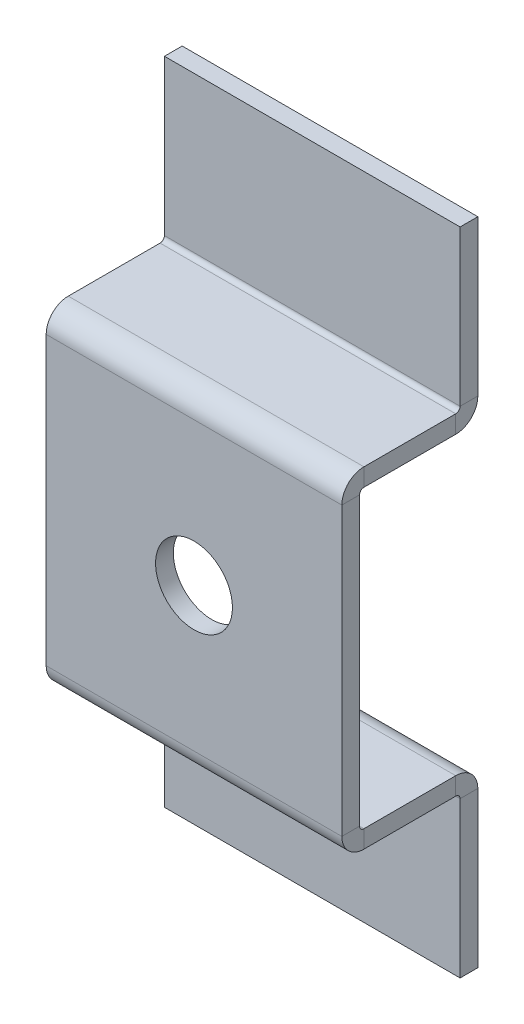
ISO-10303-21;
HEADER;
FILE_DESCRIPTION(('STEP AP214'),'2;1');
FILE_NAME('part.step','',(''),(''),'','','');
FILE_SCHEMA(('AUTOMOTIVE_DESIGN { 1 0 10303 214 1 1 1 1 }'));
ENDSEC;
DATA;
#1=APPLICATION_CONTEXT('core data for automotive mechanical design processes');
#2=APPLICATION_PROTOCOL_DEFINITION('international standard','automotive_design',2000,#1);
#3=PRODUCT_CONTEXT('',#1,'mechanical');
#4=PRODUCT('Part','Part','',(#3));
#5=PRODUCT_RELATED_PRODUCT_CATEGORY('part','',(#4));
#6=PRODUCT_DEFINITION_FORMATION('','',#4);
#7=PRODUCT_DEFINITION_CONTEXT('part definition',#1,'design');
#8=PRODUCT_DEFINITION('design','',#6,#7);
#9=PRODUCT_DEFINITION_SHAPE('','',#8);
#10=(LENGTH_UNIT() NAMED_UNIT(*) SI_UNIT(.MILLI.,.METRE.));
#11=(NAMED_UNIT(*) PLANE_ANGLE_UNIT() SI_UNIT($,.RADIAN.));
#12=(NAMED_UNIT(*) SI_UNIT($,.STERADIAN.) SOLID_ANGLE_UNIT());
#13=UNCERTAINTY_MEASURE_WITH_UNIT(LENGTH_MEASURE(1.E-05),#10,'distance_accuracy_value','');
#14=(GEOMETRIC_REPRESENTATION_CONTEXT(3) GLOBAL_UNCERTAINTY_ASSIGNED_CONTEXT((#13)) GLOBAL_UNIT_ASSIGNED_CONTEXT((#10,
#11,#12)) REPRESENTATION_CONTEXT('',''));
#15=CARTESIAN_POINT('',(0.,0.,0.));
#16=DIRECTION('',(0.,0.,1.));
#17=DIRECTION('',(1.,0.,0.));
#18=AXIS2_PLACEMENT_3D('',#15,#16,#17);
#19=CARTESIAN_POINT('',(0.,53.0000000000001,-20.));
#20=DIRECTION('',(-1.,0.,0.));
#21=DIRECTION('',(0.,0.,1.));
#22=AXIS2_PLACEMENT_3D('',#19,#20,#21);
#23=PLANE('',#22);
#24=DIRECTION('',(0.,0.,-1.));
#25=VECTOR('',#24,1.);
#26=CARTESIAN_POINT('',(0.,53.0000000000001,-20.));
#27=LINE('',#26,#25);
#28=CARTESIAN_POINT('',(0.,53.,-3.73659999999999));
#29=VERTEX_POINT('',#28);
#30=CARTESIAN_POINT('',(0.,53.0000000000001,-19.2634));
#31=VERTEX_POINT('',#30);
#32=EDGE_CURVE('E349',#29,#31,#27,.T.);
#33=ORIENTED_EDGE('',*,*,#32,.T.);
#34=DIRECTION('',(0.,-1.,0.));
#35=VECTOR('',#34,1.);
#36=CARTESIAN_POINT('',(0.,53.0000000000001,-19.2634));
#37=LINE('',#36,#35);
#38=CARTESIAN_POINT('',(0.,50.0000000000001,-19.2634));
#39=VERTEX_POINT('',#38);
#40=EDGE_CURVE('E231',#31,#39,#37,.T.);
#41=ORIENTED_EDGE('',*,*,#40,.T.);
#42=DIRECTION('',(0.,0.,-1.));
#43=VECTOR('',#42,1.);
#44=CARTESIAN_POINT('',(0.,50.0000000000001,-20.));
#45=LINE('',#44,#43);
#46=CARTESIAN_POINT('',(0.,50.,-3.7366));
#47=VERTEX_POINT('',#46);
#48=EDGE_CURVE('E348',#47,#39,#45,.T.);
#49=ORIENTED_EDGE('',*,*,#48,.F.);
#50=DIRECTION('',(0.,1.,0.));
#51=VECTOR('',#50,1.);
#52=CARTESIAN_POINT('',(0.,50.,-3.7366));
#53=LINE('',#52,#51);
#54=EDGE_CURVE('E334',#47,#29,#53,.T.);
#55=ORIENTED_EDGE('',*,*,#54,.T.);
#56=EDGE_LOOP('',(#33,#41,#49,#55));
#57=FACE_BOUND('',#56,.T.);
#58=ADVANCED_FACE('F37',(#57),#23,.T.);
#59=CARTESIAN_POINT('',(0.,53.,1.9415104735525E-13));
#60=DIRECTION('',(0.,1.,0.));
#61=DIRECTION('',(0.,0.,1.));
#62=AXIS2_PLACEMENT_3D('',#59,#60,#61);
#63=PLANE('',#62);
#64=DIRECTION('',(0.,0.,1.));
#65=VECTOR('',#64,1.);
#66=CARTESIAN_POINT('',(50.,53.,-2.99999999999999));
#67=LINE('',#66,#65);
#68=CARTESIAN_POINT('',(50.,53.0000000000001,-19.2634));
#69=VERTEX_POINT('',#68);
#70=CARTESIAN_POINT('',(50.,53.,-3.73659999999999));
#71=VERTEX_POINT('',#70);
#72=EDGE_CURVE('E351',#69,#71,#67,.T.);
#73=ORIENTED_EDGE('',*,*,#72,.F.);
#74=DIRECTION('',(-1.,0.,0.));
#75=VECTOR('',#74,1.);
#76=CARTESIAN_POINT('',(0.,53.0000000000001,-19.2634));
#77=LINE('',#76,#75);
#78=EDGE_CURVE('E61',#31,#69,#77,.F.);
#79=ORIENTED_EDGE('',*,*,#78,.F.);
#80=ORIENTED_EDGE('',*,*,#32,.F.);
#81=DIRECTION('',(1.,0.,0.));
#82=VECTOR('',#81,1.);
#83=CARTESIAN_POINT('',(0.,53.,-3.73659999999999));
#84=LINE('',#83,#82);
#85=EDGE_CURVE('E343',#29,#71,#84,.T.);
#86=ORIENTED_EDGE('',*,*,#85,.T.);
#87=EDGE_LOOP('',(#73,#79,#80,#86));
#88=FACE_BOUND('',#87,.T.);
#89=ADVANCED_FACE('F398',(#88),#63,.T.);
#90=CARTESIAN_POINT('',(0.,50.,1.83676603338721E-13));
#91=DIRECTION('',(0.,1.,0.));
#92=DIRECTION('',(0.,0.,1.));
#93=AXIS2_PLACEMENT_3D('',#90,#91,#92);
#94=PLANE('',#93);
#95=DIRECTION('',(-1.,0.,0.));
#96=VECTOR('',#95,1.);
#97=CARTESIAN_POINT('',(0.,50.0000000000001,-19.2634));
#98=LINE('',#97,#96);
#99=CARTESIAN_POINT('',(50.,50.0000000000001,-19.2634));
#100=VERTEX_POINT('',#99);
#101=EDGE_CURVE('E184',#39,#100,#98,.F.);
#102=ORIENTED_EDGE('',*,*,#101,.T.);
#103=DIRECTION('',(0.,0.,1.));
#104=VECTOR('',#103,1.);
#105=CARTESIAN_POINT('',(50.,50.,-3.));
#106=LINE('',#105,#104);
#107=CARTESIAN_POINT('',(50.,50.,-3.7366));
#108=VERTEX_POINT('',#107);
#109=EDGE_CURVE('E352',#100,#108,#106,.T.);
#110=ORIENTED_EDGE('',*,*,#109,.T.);
#111=DIRECTION('',(1.,0.,0.));
#112=VECTOR('',#111,1.);
#113=CARTESIAN_POINT('',(0.,50.,-3.7366));
#114=LINE('',#113,#112);
#115=EDGE_CURVE('E337',#47,#108,#114,.T.);
#116=ORIENTED_EDGE('',*,*,#115,.F.);
#117=ORIENTED_EDGE('',*,*,#48,.T.);
#118=EDGE_LOOP('',(#102,#110,#116,#117));
#119=FACE_BOUND('',#118,.T.);
#120=ADVANCED_FACE('F406',(#119),#94,.F.);
#121=CARTESIAN_POINT('',(50.,-3.,-2.99999999999999));
#122=DIRECTION('',(1.,0.,0.));
#123=DIRECTION('',(0.,0.,-1.));
#124=AXIS2_PLACEMENT_3D('',#121,#122,#123);
#125=PLANE('',#124);
#126=DIRECTION('',(0.,0.,-1.));
#127=VECTOR('',#126,1.);
#128=CARTESIAN_POINT('',(50.,-3.,-2.99999999999999));
#129=LINE('',#128,#127);
#130=CARTESIAN_POINT('',(50.,-3.,-3.73659999999999));
#131=VERTEX_POINT('',#130);
#132=CARTESIAN_POINT('',(50.,-3.00000000000006,-19.2634));
#133=VERTEX_POINT('',#132);
#134=EDGE_CURVE('E304',#131,#133,#129,.T.);
#135=ORIENTED_EDGE('',*,*,#134,.T.);
#136=DIRECTION('',(0.,1.,0.));
#137=VECTOR('',#136,1.);
#138=CARTESIAN_POINT('',(50.,-3.00000000000006,-19.2634));
#139=LINE('',#138,#137);
#140=CARTESIAN_POINT('',(50.,0.,-19.2634));
#141=VERTEX_POINT('',#140);
#142=EDGE_CURVE('E277',#133,#141,#139,.T.);
#143=ORIENTED_EDGE('',*,*,#142,.T.);
#144=DIRECTION('',(0.,0.,-1.));
#145=VECTOR('',#144,1.);
#146=CARTESIAN_POINT('',(50.,0.,-3.));
#147=LINE('',#146,#145);
#148=CARTESIAN_POINT('',(50.,0.,-3.7366));
#149=VERTEX_POINT('',#148);
#150=EDGE_CURVE('E303',#149,#141,#147,.T.);
#151=ORIENTED_EDGE('',*,*,#150,.F.);
#152=DIRECTION('',(0.,-1.,0.));
#153=VECTOR('',#152,1.);
#154=CARTESIAN_POINT('',(50.,0.,-3.7366));
#155=LINE('',#154,#153);
#156=EDGE_CURVE('E290',#149,#131,#155,.T.);
#157=ORIENTED_EDGE('',*,*,#156,.T.);
#158=EDGE_LOOP('',(#135,#143,#151,#157));
#159=FACE_BOUND('',#158,.T.);
#160=ADVANCED_FACE('F430',(#159),#125,.T.);
#161=CARTESIAN_POINT('',(0.,-2.99999999999999,0.));
#162=DIRECTION('',(0.,1.,0.));
#163=DIRECTION('',(0.,0.,1.));
#164=AXIS2_PLACEMENT_3D('',#161,#162,#163);
#165=PLANE('',#164);
#166=DIRECTION('',(1.,0.,0.));
#167=VECTOR('',#166,1.);
#168=CARTESIAN_POINT('',(50.,-3.00000000000006,-19.2634));
#169=LINE('',#168,#167);
#170=CARTESIAN_POINT('',(0.,-3.00000000000006,-19.2634));
#171=VERTEX_POINT('',#170);
#172=EDGE_CURVE('E283',#133,#171,#169,.F.);
#173=ORIENTED_EDGE('',*,*,#172,.F.);
#174=ORIENTED_EDGE('',*,*,#134,.F.);
#175=DIRECTION('',(1.,0.,0.));
#176=VECTOR('',#175,1.);
#177=CARTESIAN_POINT('',(0.,-3.,-3.73659999999999));
#178=LINE('',#177,#176);
#179=CARTESIAN_POINT('',(0.,-3.,-3.73659999999999));
#180=VERTEX_POINT('',#179);
#181=EDGE_CURVE('E299',#180,#131,#178,.T.);
#182=ORIENTED_EDGE('',*,*,#181,.F.);
#183=DIRECTION('',(0.,0.,1.));
#184=VECTOR('',#183,1.);
#185=CARTESIAN_POINT('',(0.,-3.00000000000006,-20.));
#186=LINE('',#185,#184);
#187=EDGE_CURVE('E307',#171,#180,#186,.T.);
#188=ORIENTED_EDGE('',*,*,#187,.F.);
#189=EDGE_LOOP('',(#173,#174,#182,#188));
#190=FACE_BOUND('',#189,.T.);
#191=ADVANCED_FACE('F443',(#190),#165,.F.);
#192=CARTESIAN_POINT('',(0.,0.,0.));
#193=DIRECTION('',(0.,1.,0.));
#194=DIRECTION('',(0.,0.,1.));
#195=AXIS2_PLACEMENT_3D('',#192,#193,#194);
#196=PLANE('',#195);
#197=ORIENTED_EDGE('',*,*,#150,.T.);
#198=DIRECTION('',(1.,0.,0.));
#199=VECTOR('',#198,1.);
#200=CARTESIAN_POINT('',(50.,0.,-19.2634));
#201=LINE('',#200,#199);
#202=CARTESIAN_POINT('',(0.,0.,-19.2634));
#203=VERTEX_POINT('',#202);
#204=EDGE_CURVE('E270',#141,#203,#201,.F.);
#205=ORIENTED_EDGE('',*,*,#204,.T.);
#206=DIRECTION('',(0.,0.,1.));
#207=VECTOR('',#206,1.);
#208=CARTESIAN_POINT('',(0.,0.,-20.));
#209=LINE('',#208,#207);
#210=CARTESIAN_POINT('',(0.,0.,-3.7366));
#211=VERTEX_POINT('',#210);
#212=EDGE_CURVE('E308',#203,#211,#209,.T.);
#213=ORIENTED_EDGE('',*,*,#212,.T.);
#214=DIRECTION('',(-1.,0.,0.));
#215=VECTOR('',#214,1.);
#216=CARTESIAN_POINT('',(50.,0.,-3.7366));
#217=LINE('',#216,#215);
#218=EDGE_CURVE('E293',#149,#211,#217,.T.);
#219=ORIENTED_EDGE('',*,*,#218,.F.);
#220=EDGE_LOOP('',(#197,#205,#213,#219));
#221=FACE_BOUND('',#220,.T.);
#222=ADVANCED_FACE('F427',(#221),#196,.T.);
#223=CARTESIAN_POINT('',(0.,0.,-3.));
#224=DIRECTION('',(0.,0.,-1.));
#225=DIRECTION('',(-1.,0.,0.));
#226=AXIS2_PLACEMENT_3D('',#223,#224,#225);
#227=PLANE('',#226);
#228=CARTESIAN_POINT('',(25.,25.0000000000001,-3.));
#229=DIRECTION('',(0.,0.,-1.));
#230=DIRECTION('',(-1.,0.,0.));
#231=AXIS2_PLACEMENT_3D('',#228,#229,#230);
#232=CIRCLE('',#231,6.50000000000001);
#233=CARTESIAN_POINT('',(18.5,25.0000000000001,-3.));
#234=VERTEX_POINT('',#233);
#235=EDGE_CURVE('E487',#234,#234,#232,.T.);
#236=ORIENTED_EDGE('',*,*,#235,.F.);
#237=EDGE_LOOP('',(#236));
#238=FACE_BOUND('',#237,.T.);
#239=DIRECTION('',(0.,1.,0.));
#240=VECTOR('',#239,1.);
#241=CARTESIAN_POINT('',(50.,0.,-3.));
#242=LINE('',#241,#240);
#243=CARTESIAN_POINT('',(50.,0.736600000000001,-3.));
#244=VERTEX_POINT('',#243);
#245=CARTESIAN_POINT('',(50.,49.2634,-3.));
#246=VERTEX_POINT('',#245);
#247=EDGE_CURVE('E11',#244,#246,#242,.T.);
#248=ORIENTED_EDGE('',*,*,#247,.F.);
#249=DIRECTION('',(-1.,0.,0.));
#250=VECTOR('',#249,1.);
#251=CARTESIAN_POINT('',(0.,0.736599999999997,-3.));
#252=LINE('',#251,#250);
#253=CARTESIAN_POINT('',(0.,0.736599999999997,-3.));
#254=VERTEX_POINT('',#253);
#255=EDGE_CURVE('E326',#254,#244,#252,.F.);
#256=ORIENTED_EDGE('',*,*,#255,.F.);
#257=DIRECTION('',(0.,-1.,0.));
#258=VECTOR('',#257,1.);
#259=CARTESIAN_POINT('',(0.,0.,-3.));
#260=LINE('',#259,#258);
#261=CARTESIAN_POINT('',(0.,49.2634,-3.));
#262=VERTEX_POINT('',#261);
#263=EDGE_CURVE('E46',#262,#254,#260,.T.);
#264=ORIENTED_EDGE('',*,*,#263,.F.);
#265=DIRECTION('',(1.,0.,0.));
#266=VECTOR('',#265,1.);
#267=CARTESIAN_POINT('',(50.,49.2634,-3.00000000000001));
#268=LINE('',#267,#266);
#269=EDGE_CURVE('E370',#246,#262,#268,.F.);
#270=ORIENTED_EDGE('',*,*,#269,.F.);
#271=EDGE_LOOP('',(#248,#256,#264,#270));
#272=FACE_BOUND('',#271,.T.);
#273=ADVANCED_FACE('F413',(#238,#272),#227,.T.);
#274=CARTESIAN_POINT('',(0.,0.,0.));
#275=DIRECTION('',(0.,0.,-1.));
#276=DIRECTION('',(-1.,0.,0.));
#277=AXIS2_PLACEMENT_3D('',#274,#275,#276);
#278=PLANE('',#277);
#279=CARTESIAN_POINT('',(25.,25.0000000000001,0.));
#280=DIRECTION('',(0.,0.,1.));
#281=DIRECTION('',(1.,0.,0.));
#282=AXIS2_PLACEMENT_3D('',#279,#280,#281);
#283=CIRCLE('',#282,6.50000000000001);
#284=CARTESIAN_POINT('',(31.5,25.0000000000001,0.));
#285=VERTEX_POINT('',#284);
#286=EDGE_CURVE('E485',#285,#285,#283,.T.);
#287=ORIENTED_EDGE('',*,*,#286,.F.);
#288=EDGE_LOOP('',(#287));
#289=FACE_BOUND('',#288,.T.);
#290=DIRECTION('',(-1.,0.,0.));
#291=VECTOR('',#290,1.);
#292=CARTESIAN_POINT('',(0.,0.736600000000005,0.));
#293=LINE('',#292,#291);
#294=CARTESIAN_POINT('',(0.,0.736600000000005,0.));
#295=VERTEX_POINT('',#294);
#296=CARTESIAN_POINT('',(50.,0.736600000000001,0.));
#297=VERTEX_POINT('',#296);
#298=EDGE_CURVE('E314',#295,#297,#293,.F.);
#299=ORIENTED_EDGE('',*,*,#298,.T.);
#300=DIRECTION('',(0.,1.,0.));
#301=VECTOR('',#300,1.);
#302=CARTESIAN_POINT('',(50.,0.,0.));
#303=LINE('',#302,#301);
#304=CARTESIAN_POINT('',(50.,49.2634,0.));
#305=VERTEX_POINT('',#304);
#306=EDGE_CURVE('E41',#297,#305,#303,.T.);
#307=ORIENTED_EDGE('',*,*,#306,.T.);
#308=DIRECTION('',(1.,0.,0.));
#309=VECTOR('',#308,1.);
#310=CARTESIAN_POINT('',(50.,49.2634,0.));
#311=LINE('',#310,#309);
#312=CARTESIAN_POINT('',(0.,49.2634,0.));
#313=VERTEX_POINT('',#312);
#314=EDGE_CURVE('E358',#305,#313,#311,.F.);
#315=ORIENTED_EDGE('',*,*,#314,.T.);
#316=DIRECTION('',(0.,-1.,0.));
#317=VECTOR('',#316,1.);
#318=CARTESIAN_POINT('',(0.,0.,0.));
#319=LINE('',#318,#317);
#320=EDGE_CURVE('E378',#313,#295,#319,.T.);
#321=ORIENTED_EDGE('',*,*,#320,.T.);
#322=EDGE_LOOP('',(#299,#307,#315,#321));
#323=FACE_BOUND('',#322,.T.);
#324=ADVANCED_FACE('F386',(#289,#323),#278,.F.);
#325=CARTESIAN_POINT('',(0.,0.,-3.));
#326=DIRECTION('',(-1.,0.,0.));
#327=DIRECTION('',(0.,0.,1.));
#328=AXIS2_PLACEMENT_3D('',#325,#326,#327);
#329=PLANE('',#328);
#330=ORIENTED_EDGE('',*,*,#263,.T.);
#331=DIRECTION('',(0.,0.,1.));
#332=VECTOR('',#331,1.);
#333=CARTESIAN_POINT('',(0.,0.736599999999997,-3.));
#334=LINE('',#333,#332);
#335=EDGE_CURVE('E320',#254,#295,#334,.T.);
#336=ORIENTED_EDGE('',*,*,#335,.T.);
#337=ORIENTED_EDGE('',*,*,#320,.F.);
#338=DIRECTION('',(0.,0.,1.));
#339=VECTOR('',#338,1.);
#340=CARTESIAN_POINT('',(0.,49.2634,-3.00000000000001));
#341=LINE('',#340,#339);
#342=EDGE_CURVE('E375',#262,#313,#341,.T.);
#343=ORIENTED_EDGE('',*,*,#342,.F.);
#344=EDGE_LOOP('',(#330,#336,#337,#343));
#345=FACE_BOUND('',#344,.T.);
#346=ADVANCED_FACE('F39',(#345),#329,.T.);
#347=CARTESIAN_POINT('',(50.,0.,-3.));
#348=DIRECTION('',(1.,0.,0.));
#349=DIRECTION('',(0.,0.,-1.));
#350=AXIS2_PLACEMENT_3D('',#347,#348,#349);
#351=PLANE('',#350);
#352=DIRECTION('',(0.,0.,1.));
#353=VECTOR('',#352,1.);
#354=CARTESIAN_POINT('',(50.,0.736600000000001,-3.));
#355=LINE('',#354,#353);
#356=EDGE_CURVE('E331',#244,#297,#355,.T.);
#357=ORIENTED_EDGE('',*,*,#356,.F.);
#358=ORIENTED_EDGE('',*,*,#247,.T.);
#359=DIRECTION('',(0.,0.,1.));
#360=VECTOR('',#359,1.);
#361=CARTESIAN_POINT('',(50.,49.2634,-3.00000000000001));
#362=LINE('',#361,#360);
#363=EDGE_CURVE('E364',#246,#305,#362,.T.);
#364=ORIENTED_EDGE('',*,*,#363,.T.);
#365=ORIENTED_EDGE('',*,*,#306,.F.);
#366=EDGE_LOOP('',(#357,#358,#364,#365));
#367=FACE_BOUND('',#366,.T.);
#368=ADVANCED_FACE('F453',(#367),#351,.T.);
#369=CARTESIAN_POINT('',(0.,49.2634,-3.7366));
#370=DIRECTION('',(-1.,0.,0.));
#371=DIRECTION('',(0.,0.,1.));
#372=AXIS2_PLACEMENT_3D('',#369,#370,#371);
#373=PLANE('',#372);
#374=ORIENTED_EDGE('',*,*,#54,.F.);
#375=CARTESIAN_POINT('',(0.,49.2634,-3.7366));
#376=DIRECTION('',(1.,0.,0.));
#377=DIRECTION('',(0.,0.,-1.));
#378=AXIS2_PLACEMENT_3D('',#375,#376,#377);
#379=CIRCLE('',#378,0.73659999999999);
#380=EDGE_CURVE('E367',#262,#47,#379,.F.);
#381=ORIENTED_EDGE('',*,*,#380,.F.);
#382=ORIENTED_EDGE('',*,*,#342,.T.);
#383=CARTESIAN_POINT('',(0.,49.2634,-3.7366));
#384=DIRECTION('',(1.,0.,0.));
#385=DIRECTION('',(0.,0.,-1.));
#386=AXIS2_PLACEMENT_3D('',#383,#384,#385);
#387=CIRCLE('',#386,3.73659999999999);
#388=EDGE_CURVE('E360',#313,#29,#387,.F.);
#389=ORIENTED_EDGE('',*,*,#388,.T.);
#390=EDGE_LOOP('',(#374,#381,#382,#389));
#391=FACE_BOUND('',#390,.T.);
#392=ADVANCED_FACE('F400',(#391),#373,.T.);
#393=CARTESIAN_POINT('',(50.,49.2634,-3.7366));
#394=DIRECTION('',(-1.,0.,0.));
#395=DIRECTION('',(0.,0.,1.));
#396=AXIS2_PLACEMENT_3D('',#393,#394,#395);
#397=PLANE('',#396);
#398=CARTESIAN_POINT('',(50.,49.2634,-3.7366));
#399=DIRECTION('',(1.,0.,0.));
#400=DIRECTION('',(0.,0.,-1.));
#401=AXIS2_PLACEMENT_3D('',#398,#399,#400);
#402=CIRCLE('',#401,0.73659999999999);
#403=EDGE_CURVE('E354',#108,#246,#402,.T.);
#404=ORIENTED_EDGE('',*,*,#403,.F.);
#405=DIRECTION('',(0.,1.,0.));
#406=VECTOR('',#405,1.);
#407=CARTESIAN_POINT('',(50.,50.,-3.7366));
#408=LINE('',#407,#406);
#409=EDGE_CURVE('E340',#108,#71,#408,.T.);
#410=ORIENTED_EDGE('',*,*,#409,.T.);
#411=CARTESIAN_POINT('',(50.,49.2634,-3.7366));
#412=DIRECTION('',(1.,0.,0.));
#413=DIRECTION('',(0.,0.,-1.));
#414=AXIS2_PLACEMENT_3D('',#411,#412,#413);
#415=CIRCLE('',#414,3.73659999999999);
#416=EDGE_CURVE('E361',#71,#305,#415,.T.);
#417=ORIENTED_EDGE('',*,*,#416,.T.);
#418=ORIENTED_EDGE('',*,*,#363,.F.);
#419=EDGE_LOOP('',(#404,#410,#417,#418));
#420=FACE_BOUND('',#419,.T.);
#421=ADVANCED_FACE('F396',(#420),#397,.F.);
#422=CARTESIAN_POINT('',(50.,49.2634,-3.7366));
#423=DIRECTION('',(1.,0.,0.));
#424=DIRECTION('',(0.,1.,0.));
#425=AXIS2_PLACEMENT_3D('',#422,#423,#424);
#426=CYLINDRICAL_SURFACE('',#425,3.73659999999999);
#427=ORIENTED_EDGE('',*,*,#314,.F.);
#428=ORIENTED_EDGE('',*,*,#416,.F.);
#429=ORIENTED_EDGE('',*,*,#85,.F.);
#430=ORIENTED_EDGE('',*,*,#388,.F.);
#431=EDGE_LOOP('',(#427,#428,#429,#430));
#432=FACE_BOUND('',#431,.T.);
#433=ADVANCED_FACE('F392',(#432),#426,.T.);
#434=CARTESIAN_POINT('',(50.,49.2634,-3.7366));
#435=DIRECTION('',(1.,0.,0.));
#436=DIRECTION('',(0.,1.,0.));
#437=AXIS2_PLACEMENT_3D('',#434,#435,#436);
#438=CYLINDRICAL_SURFACE('',#437,0.73659999999999);
#439=ORIENTED_EDGE('',*,*,#269,.T.);
#440=ORIENTED_EDGE('',*,*,#380,.T.);
#441=ORIENTED_EDGE('',*,*,#115,.T.);
#442=ORIENTED_EDGE('',*,*,#403,.T.);
#443=EDGE_LOOP('',(#439,#440,#441,#442));
#444=FACE_BOUND('',#443,.T.);
#445=ADVANCED_FACE('F408',(#444),#438,.F.);
#446=CARTESIAN_POINT('',(50.,53.,-2.99999999999999));
#447=DIRECTION('',(1.,0.,0.));
#448=DIRECTION('',(0.,0.,-1.));
#449=AXIS2_PLACEMENT_3D('',#446,#447,#448);
#450=PLANE('',#449);
#451=DIRECTION('',(0.,-1.,0.));
#452=VECTOR('',#451,1.);
#453=CARTESIAN_POINT('',(50.,53.0000000000001,-19.2634));
#454=LINE('',#453,#452);
#455=EDGE_CURVE('E54',#69,#100,#454,.T.);
#456=ORIENTED_EDGE('',*,*,#455,.F.);
#457=ORIENTED_EDGE('',*,*,#72,.T.);
#458=ORIENTED_EDGE('',*,*,#409,.F.);
#459=ORIENTED_EDGE('',*,*,#109,.F.);
#460=EDGE_LOOP('',(#456,#457,#458,#459));
#461=FACE_BOUND('',#460,.T.);
#462=ADVANCED_FACE('F469',(#461),#450,.T.);
#463=CARTESIAN_POINT('',(50.,0.736599999999999,-3.7366));
#464=DIRECTION('',(1.,0.,0.));
#465=DIRECTION('',(0.,1.,0.));
#466=AXIS2_PLACEMENT_3D('',#463,#464,#465);
#467=PLANE('',#466);
#468=ORIENTED_EDGE('',*,*,#156,.F.);
#469=CARTESIAN_POINT('',(50.,0.736599999999999,-3.7366));
#470=DIRECTION('',(-1.,0.,0.));
#471=DIRECTION('',(0.,-1.,0.));
#472=AXIS2_PLACEMENT_3D('',#469,#470,#471);
#473=CIRCLE('',#472,0.736600000000002);
#474=EDGE_CURVE('E323',#244,#149,#473,.F.);
#475=ORIENTED_EDGE('',*,*,#474,.F.);
#476=ORIENTED_EDGE('',*,*,#356,.T.);
#477=CARTESIAN_POINT('',(50.,0.736599999999999,-3.7366));
#478=DIRECTION('',(-1.,0.,0.));
#479=DIRECTION('',(0.,-1.,0.));
#480=AXIS2_PLACEMENT_3D('',#477,#478,#479);
#481=CIRCLE('',#480,3.7366);
#482=EDGE_CURVE('E316',#297,#131,#481,.F.);
#483=ORIENTED_EDGE('',*,*,#482,.T.);
#484=EDGE_LOOP('',(#468,#475,#476,#483));
#485=FACE_BOUND('',#484,.T.);
#486=ADVANCED_FACE('F452',(#485),#467,.T.);
#487=CARTESIAN_POINT('',(0.,0.736599999999996,-3.7366));
#488=DIRECTION('',(1.,0.,0.));
#489=DIRECTION('',(0.,1.,0.));
#490=AXIS2_PLACEMENT_3D('',#487,#488,#489);
#491=PLANE('',#490);
#492=CARTESIAN_POINT('',(0.,0.736599999999996,-3.7366));
#493=DIRECTION('',(-1.,0.,0.));
#494=DIRECTION('',(0.,-1.,0.));
#495=AXIS2_PLACEMENT_3D('',#492,#493,#494);
#496=CIRCLE('',#495,0.736600000000002);
#497=EDGE_CURVE('E310',#211,#254,#496,.T.);
#498=ORIENTED_EDGE('',*,*,#497,.F.);
#499=DIRECTION('',(0.,-1.,0.));
#500=VECTOR('',#499,1.);
#501=CARTESIAN_POINT('',(0.,0.,-3.7366));
#502=LINE('',#501,#500);
#503=EDGE_CURVE('E296',#211,#180,#502,.T.);
#504=ORIENTED_EDGE('',*,*,#503,.T.);
#505=CARTESIAN_POINT('',(0.,0.736599999999996,-3.7366));
#506=DIRECTION('',(-1.,0.,0.));
#507=DIRECTION('',(0.,-1.,0.));
#508=AXIS2_PLACEMENT_3D('',#505,#506,#507);
#509=CIRCLE('',#508,3.7366);
#510=EDGE_CURVE('E317',#180,#295,#509,.T.);
#511=ORIENTED_EDGE('',*,*,#510,.T.);
#512=ORIENTED_EDGE('',*,*,#335,.F.);
#513=EDGE_LOOP('',(#498,#504,#511,#512));
#514=FACE_BOUND('',#513,.T.);
#515=ADVANCED_FACE('F418',(#514),#491,.F.);
#516=CARTESIAN_POINT('',(0.,0.736599999999996,-3.7366));
#517=DIRECTION('',(-1.,0.,0.));
#518=DIRECTION('',(0.,-1.,0.));
#519=AXIS2_PLACEMENT_3D('',#516,#517,#518);
#520=CYLINDRICAL_SURFACE('',#519,3.7366);
#521=ORIENTED_EDGE('',*,*,#298,.F.);
#522=ORIENTED_EDGE('',*,*,#510,.F.);
#523=ORIENTED_EDGE('',*,*,#181,.T.);
#524=ORIENTED_EDGE('',*,*,#482,.F.);
#525=EDGE_LOOP('',(#521,#522,#523,#524));
#526=FACE_BOUND('',#525,.T.);
#527=ADVANCED_FACE('F449',(#526),#520,.T.);
#528=CARTESIAN_POINT('',(0.,0.736599999999996,-3.7366));
#529=DIRECTION('',(-1.,0.,0.));
#530=DIRECTION('',(0.,-1.,0.));
#531=AXIS2_PLACEMENT_3D('',#528,#529,#530);
#532=CYLINDRICAL_SURFACE('',#531,0.736600000000002);
#533=ORIENTED_EDGE('',*,*,#255,.T.);
#534=ORIENTED_EDGE('',*,*,#474,.T.);
#535=ORIENTED_EDGE('',*,*,#218,.T.);
#536=ORIENTED_EDGE('',*,*,#497,.T.);
#537=EDGE_LOOP('',(#533,#534,#535,#536));
#538=FACE_BOUND('',#537,.T.);
#539=ADVANCED_FACE('F422',(#538),#532,.F.);
#540=CARTESIAN_POINT('',(0.,-3.00000000000006,-20.));
#541=DIRECTION('',(-1.,0.,0.));
#542=DIRECTION('',(0.,0.,1.));
#543=AXIS2_PLACEMENT_3D('',#540,#541,#542);
#544=PLANE('',#543);
#545=DIRECTION('',(0.,1.,0.));
#546=VECTOR('',#545,1.);
#547=CARTESIAN_POINT('',(0.,-3.00000000000006,-19.2634));
#548=LINE('',#547,#546);
#549=EDGE_CURVE('E287',#171,#203,#548,.T.);
#550=ORIENTED_EDGE('',*,*,#549,.F.);
#551=ORIENTED_EDGE('',*,*,#187,.T.);
#552=ORIENTED_EDGE('',*,*,#503,.F.);
#553=ORIENTED_EDGE('',*,*,#212,.F.);
#554=EDGE_LOOP('',(#550,#551,#552,#553));
#555=FACE_BOUND('',#554,.T.);
#556=ADVANCED_FACE('F447',(#555),#544,.T.);
#557=CARTESIAN_POINT('',(0.,-3.73660000000006,-19.2634));
#558=DIRECTION('',(-1.,0.,0.));
#559=DIRECTION('',(0.,0.,1.));
#560=AXIS2_PLACEMENT_3D('',#557,#558,#559);
#561=PLANE('',#560);
#562=DIRECTION('',(0.,0.,-1.));
#563=VECTOR('',#562,1.);
#564=CARTESIAN_POINT('',(0.,-3.73660000000006,-20.));
#565=LINE('',#564,#563);
#566=CARTESIAN_POINT('',(0.,-3.73660000000006,-20.));
#567=VERTEX_POINT('',#566);
#568=CARTESIAN_POINT('',(0.,-3.73660000000006,-23.));
#569=VERTEX_POINT('',#568);
#570=EDGE_CURVE('E238',#567,#569,#565,.T.);
#571=ORIENTED_EDGE('',*,*,#570,.F.);
#572=CARTESIAN_POINT('',(0.,-3.73660000000006,-19.2634));
#573=DIRECTION('',(1.,0.,0.));
#574=DIRECTION('',(0.,0.,-1.));
#575=AXIS2_PLACEMENT_3D('',#572,#573,#574);
#576=CIRCLE('',#575,0.7366);
#577=EDGE_CURVE('E280',#171,#567,#576,.F.);
#578=ORIENTED_EDGE('',*,*,#577,.F.);
#579=ORIENTED_EDGE('',*,*,#549,.T.);
#580=CARTESIAN_POINT('',(0.,-3.73660000000006,-19.2634));
#581=DIRECTION('',(1.,0.,0.));
#582=DIRECTION('',(0.,0.,-1.));
#583=AXIS2_PLACEMENT_3D('',#580,#581,#582);
#584=CIRCLE('',#583,3.7366);
#585=EDGE_CURVE('E273',#203,#569,#584,.F.);
#586=ORIENTED_EDGE('',*,*,#585,.T.);
#587=EDGE_LOOP('',(#571,#578,#579,#586));
#588=FACE_BOUND('',#587,.T.);
#589=ADVANCED_FACE('F557',(#588),#561,.T.);
#590=CARTESIAN_POINT('',(50.,-3.73660000000006,-19.2634));
#591=DIRECTION('',(-1.,0.,0.));
#592=DIRECTION('',(0.,0.,1.));
#593=AXIS2_PLACEMENT_3D('',#590,#591,#592);
#594=PLANE('',#593);
#595=CARTESIAN_POINT('',(50.,-3.73660000000006,-19.2634));
#596=DIRECTION('',(1.,0.,0.));
#597=DIRECTION('',(0.,0.,-1.));
#598=AXIS2_PLACEMENT_3D('',#595,#596,#597);
#599=CIRCLE('',#598,0.7366);
#600=CARTESIAN_POINT('',(50.,-3.73660000000006,-20.));
#601=VERTEX_POINT('',#600);
#602=EDGE_CURVE('E269',#601,#133,#599,.T.);
#603=ORIENTED_EDGE('',*,*,#602,.F.);
#604=DIRECTION('',(0.,0.,-1.));
#605=VECTOR('',#604,1.);
#606=CARTESIAN_POINT('',(50.,-3.73660000000006,-20.));
#607=LINE('',#606,#605);
#608=CARTESIAN_POINT('',(50.,-3.73660000000003,-23.));
#609=VERTEX_POINT('',#608);
#610=EDGE_CURVE('E242',#601,#609,#607,.T.);
#611=ORIENTED_EDGE('',*,*,#610,.T.);
#612=CARTESIAN_POINT('',(50.,-3.73660000000006,-19.2634));
#613=DIRECTION('',(1.,0.,0.));
#614=DIRECTION('',(0.,0.,-1.));
#615=AXIS2_PLACEMENT_3D('',#612,#613,#614);
#616=CIRCLE('',#615,3.7366);
#617=EDGE_CURVE('E274',#609,#141,#616,.T.);
#618=ORIENTED_EDGE('',*,*,#617,.T.);
#619=ORIENTED_EDGE('',*,*,#142,.F.);
#620=EDGE_LOOP('',(#603,#611,#618,#619));
#621=FACE_BOUND('',#620,.T.);
#622=ADVANCED_FACE('F434',(#621),#594,.F.);
#623=CARTESIAN_POINT('',(50.,-3.73660000000006,-19.2634));
#624=DIRECTION('',(1.,0.,0.));
#625=DIRECTION('',(0.,0.,-1.));
#626=AXIS2_PLACEMENT_3D('',#623,#624,#625);
#627=CYLINDRICAL_SURFACE('',#626,3.7366);
#628=ORIENTED_EDGE('',*,*,#204,.F.);
#629=ORIENTED_EDGE('',*,*,#617,.F.);
#630=DIRECTION('',(-1.,0.,0.));
#631=VECTOR('',#630,1.);
#632=CARTESIAN_POINT('',(0.,-3.73660000000003,-23.));
#633=LINE('',#632,#631);
#634=EDGE_CURVE('E245',#609,#569,#633,.T.);
#635=ORIENTED_EDGE('',*,*,#634,.T.);
#636=ORIENTED_EDGE('',*,*,#585,.F.);
#637=EDGE_LOOP('',(#628,#629,#635,#636));
#638=FACE_BOUND('',#637,.T.);
#639=ADVANCED_FACE('F551',(#638),#627,.T.);
#640=CARTESIAN_POINT('',(50.,-3.73660000000006,-19.2634));
#641=DIRECTION('',(1.,0.,0.));
#642=DIRECTION('',(0.,0.,-1.));
#643=AXIS2_PLACEMENT_3D('',#640,#641,#642);
#644=CYLINDRICAL_SURFACE('',#643,0.7366);
#645=ORIENTED_EDGE('',*,*,#172,.T.);
#646=ORIENTED_EDGE('',*,*,#577,.T.);
#647=DIRECTION('',(1.,0.,0.));
#648=VECTOR('',#647,1.);
#649=CARTESIAN_POINT('',(0.,-3.73660000000006,-20.));
#650=LINE('',#649,#648);
#651=EDGE_CURVE('E240',#567,#601,#650,.T.);
#652=ORIENTED_EDGE('',*,*,#651,.T.);
#653=ORIENTED_EDGE('',*,*,#602,.T.);
#654=EDGE_LOOP('',(#645,#646,#652,#653));
#655=FACE_BOUND('',#654,.T.);
#656=ADVANCED_FACE('F438',(#655),#644,.F.);
#657=CARTESIAN_POINT('',(50.,-30.0000000000001,-23.));
#658=DIRECTION('',(-1.,0.,0.));
#659=DIRECTION('',(0.,0.,1.));
#660=AXIS2_PLACEMENT_3D('',#657,#658,#659);
#661=PLANE('',#660);
#662=ORIENTED_EDGE('',*,*,#610,.F.);
#663=DIRECTION('',(0.,-1.,0.));
#664=VECTOR('',#663,1.);
#665=CARTESIAN_POINT('',(50.,-30.0000000000001,-20.));
#666=LINE('',#665,#664);
#667=CARTESIAN_POINT('',(50.,-30.0000000000001,-20.));
#668=VERTEX_POINT('',#667);
#669=EDGE_CURVE('E249',#601,#668,#666,.T.);
#670=ORIENTED_EDGE('',*,*,#669,.T.);
#671=DIRECTION('',(0.,0.,1.));
#672=VECTOR('',#671,1.);
#673=CARTESIAN_POINT('',(50.,-30.0000000000001,-23.));
#674=LINE('',#673,#672);
#675=CARTESIAN_POINT('',(50.,-30.0000000000001,-23.));
#676=VERTEX_POINT('',#675);
#677=EDGE_CURVE('E266',#676,#668,#674,.T.);
#678=ORIENTED_EDGE('',*,*,#677,.F.);
#679=DIRECTION('',(0.,-1.,0.));
#680=VECTOR('',#679,1.);
#681=CARTESIAN_POINT('',(50.,-30.0000000000001,-23.));
#682=LINE('',#681,#680);
#683=EDGE_CURVE('E250',#609,#676,#682,.T.);
#684=ORIENTED_EDGE('',*,*,#683,.F.);
#685=EDGE_LOOP('',(#662,#670,#678,#684));
#686=FACE_BOUND('',#685,.T.);
#687=ADVANCED_FACE('F543',(#686),#661,.F.);
#688=CARTESIAN_POINT('',(0.,-3.00000000000006,-23.));
#689=DIRECTION('',(1.,0.,0.));
#690=DIRECTION('',(0.,0.,-1.));
#691=AXIS2_PLACEMENT_3D('',#688,#689,#690);
#692=PLANE('',#691);
#693=ORIENTED_EDGE('',*,*,#570,.T.);
#694=DIRECTION('',(0.,1.,0.));
#695=VECTOR('',#694,1.);
#696=CARTESIAN_POINT('',(0.,-3.00000000000006,-23.));
#697=LINE('',#696,#695);
#698=CARTESIAN_POINT('',(0.,-30.0000000000001,-23.));
#699=VERTEX_POINT('',#698);
#700=EDGE_CURVE('E255',#699,#569,#697,.T.);
#701=ORIENTED_EDGE('',*,*,#700,.F.);
#702=DIRECTION('',(0.,0.,1.));
#703=VECTOR('',#702,1.);
#704=CARTESIAN_POINT('',(0.,-30.0000000000001,-23.));
#705=LINE('',#704,#703);
#706=CARTESIAN_POINT('',(0.,-30.0000000000001,-20.));
#707=VERTEX_POINT('',#706);
#708=EDGE_CURVE('E258',#699,#707,#705,.T.);
#709=ORIENTED_EDGE('',*,*,#708,.T.);
#710=DIRECTION('',(0.,1.,0.));
#711=VECTOR('',#710,1.);
#712=CARTESIAN_POINT('',(0.,-3.00000000000006,-20.));
#713=LINE('',#712,#711);
#714=EDGE_CURVE('E253',#707,#567,#713,.T.);
#715=ORIENTED_EDGE('',*,*,#714,.T.);
#716=EDGE_LOOP('',(#693,#701,#709,#715));
#717=FACE_BOUND('',#716,.T.);
#718=ADVANCED_FACE('F536',(#717),#692,.F.);
#719=CARTESIAN_POINT('',(0.,0.,-23.));
#720=DIRECTION('',(0.,0.,1.));
#721=DIRECTION('',(1.,0.,0.));
#722=AXIS2_PLACEMENT_3D('',#719,#720,#721);
#723=PLANE('',#722);
#724=ORIENTED_EDGE('',*,*,#634,.F.);
#725=ORIENTED_EDGE('',*,*,#683,.T.);
#726=DIRECTION('',(-1.,0.,0.));
#727=VECTOR('',#726,1.);
#728=CARTESIAN_POINT('',(0.,-30.0000000000001,-23.));
#729=LINE('',#728,#727);
#730=EDGE_CURVE('E252',#676,#699,#729,.T.);
#731=ORIENTED_EDGE('',*,*,#730,.T.);
#732=ORIENTED_EDGE('',*,*,#700,.T.);
#733=EDGE_LOOP('',(#724,#725,#731,#732));
#734=FACE_BOUND('',#733,.T.);
#735=ADVANCED_FACE('F532',(#734),#723,.F.);
#736=CARTESIAN_POINT('',(0.,0.,-20.));
#737=DIRECTION('',(0.,0.,1.));
#738=DIRECTION('',(1.,0.,0.));
#739=AXIS2_PLACEMENT_3D('',#736,#737,#738);
#740=PLANE('',#739);
#741=ORIENTED_EDGE('',*,*,#669,.F.);
#742=ORIENTED_EDGE('',*,*,#651,.F.);
#743=ORIENTED_EDGE('',*,*,#714,.F.);
#744=DIRECTION('',(-1.,0.,0.));
#745=VECTOR('',#744,1.);
#746=CARTESIAN_POINT('',(0.,-30.0000000000001,-20.));
#747=LINE('',#746,#745);
#748=EDGE_CURVE('E260',#668,#707,#747,.T.);
#749=ORIENTED_EDGE('',*,*,#748,.F.);
#750=EDGE_LOOP('',(#741,#742,#743,#749));
#751=FACE_BOUND('',#750,.T.);
#752=ADVANCED_FACE('F535',(#751),#740,.T.);
#753=CARTESIAN_POINT('',(0.,-30.0000000000001,-23.));
#754=DIRECTION('',(0.,1.,0.));
#755=DIRECTION('',(0.,0.,1.));
#756=AXIS2_PLACEMENT_3D('',#753,#754,#755);
#757=PLANE('',#756);
#758=ORIENTED_EDGE('',*,*,#748,.T.);
#759=ORIENTED_EDGE('',*,*,#708,.F.);
#760=ORIENTED_EDGE('',*,*,#730,.F.);
#761=ORIENTED_EDGE('',*,*,#677,.T.);
#762=EDGE_LOOP('',(#758,#759,#760,#761));
#763=FACE_BOUND('',#762,.T.);
#764=ADVANCED_FACE('F529',(#763),#757,.F.);
#765=CARTESIAN_POINT('',(50.,53.7366000000001,-19.2634));
#766=DIRECTION('',(1.,0.,0.));
#767=DIRECTION('',(0.,0.,-1.));
#768=AXIS2_PLACEMENT_3D('',#765,#766,#767);
#769=PLANE('',#768);
#770=DIRECTION('',(0.,0.,-1.));
#771=VECTOR('',#770,1.);
#772=CARTESIAN_POINT('',(50.,53.7366000000001,-20.));
#773=LINE('',#772,#771);
#774=CARTESIAN_POINT('',(50.,53.7366000000001,-20.));
#775=VERTEX_POINT('',#774);
#776=CARTESIAN_POINT('',(50.,53.7366000000001,-23.));
#777=VERTEX_POINT('',#776);
#778=EDGE_CURVE('E490',#775,#777,#773,.T.);
#779=ORIENTED_EDGE('',*,*,#778,.F.);
#780=CARTESIAN_POINT('',(50.,53.7366000000001,-19.2634));
#781=DIRECTION('',(-1.,0.,0.));
#782=DIRECTION('',(0.,0.,1.));
#783=AXIS2_PLACEMENT_3D('',#780,#781,#782);
#784=CIRCLE('',#783,0.736600000000004);
#785=EDGE_CURVE('E187',#69,#775,#784,.F.);
#786=ORIENTED_EDGE('',*,*,#785,.F.);
#787=ORIENTED_EDGE('',*,*,#455,.T.);
#788=CARTESIAN_POINT('',(50.,53.7366000000001,-19.2634));
#789=DIRECTION('',(-1.,0.,0.));
#790=DIRECTION('',(0.,0.,1.));
#791=AXIS2_PLACEMENT_3D('',#788,#789,#790);
#792=CIRCLE('',#791,3.7366);
#793=EDGE_CURVE('E230',#100,#777,#792,.F.);
#794=ORIENTED_EDGE('',*,*,#793,.T.);
#795=EDGE_LOOP('',(#779,#786,#787,#794));
#796=FACE_BOUND('',#795,.T.);
#797=ADVANCED_FACE('F499',(#796),#769,.T.);
#798=CARTESIAN_POINT('',(0.,53.7366000000001,-19.2634));
#799=DIRECTION('',(1.,0.,0.));
#800=DIRECTION('',(0.,0.,-1.));
#801=AXIS2_PLACEMENT_3D('',#798,#799,#800);
#802=PLANE('',#801);
#803=CARTESIAN_POINT('',(0.,53.7366000000001,-19.2634));
#804=DIRECTION('',(-1.,0.,0.));
#805=DIRECTION('',(0.,0.,1.));
#806=AXIS2_PLACEMENT_3D('',#803,#804,#805);
#807=CIRCLE('',#806,0.736600000000004);
#808=CARTESIAN_POINT('',(0.,53.7366000000001,-20.));
#809=VERTEX_POINT('',#808);
#810=EDGE_CURVE('E194',#809,#31,#807,.T.);
#811=ORIENTED_EDGE('',*,*,#810,.F.);
#812=DIRECTION('',(0.,0.,-1.));
#813=VECTOR('',#812,1.);
#814=CARTESIAN_POINT('',(0.,53.7366000000001,-20.));
#815=LINE('',#814,#813);
#816=CARTESIAN_POINT('',(0.,53.7366000000001,-23.));
#817=VERTEX_POINT('',#816);
#818=EDGE_CURVE('E191',#809,#817,#815,.T.);
#819=ORIENTED_EDGE('',*,*,#818,.T.);
#820=CARTESIAN_POINT('',(0.,53.7366000000001,-19.2634));
#821=DIRECTION('',(-1.,0.,0.));
#822=DIRECTION('',(0.,0.,1.));
#823=AXIS2_PLACEMENT_3D('',#820,#821,#822);
#824=CIRCLE('',#823,3.7366);
#825=EDGE_CURVE('E177',#817,#39,#824,.T.);
#826=ORIENTED_EDGE('',*,*,#825,.T.);
#827=ORIENTED_EDGE('',*,*,#40,.F.);
#828=EDGE_LOOP('',(#811,#819,#826,#827));
#829=FACE_BOUND('',#828,.T.);
#830=ADVANCED_FACE('F192',(#829),#802,.F.);
#831=CARTESIAN_POINT('',(0.,53.7366000000001,-19.2634));
#832=DIRECTION('',(-1.,0.,0.));
#833=DIRECTION('',(0.,0.,-1.));
#834=AXIS2_PLACEMENT_3D('',#831,#832,#833);
#835=CYLINDRICAL_SURFACE('',#834,3.7366);
#836=ORIENTED_EDGE('',*,*,#101,.F.);
#837=ORIENTED_EDGE('',*,*,#825,.F.);
#838=DIRECTION('',(1.,0.,0.));
#839=VECTOR('',#838,1.);
#840=CARTESIAN_POINT('',(0.,53.7366000000001,-23.));
#841=LINE('',#840,#839);
#842=EDGE_CURVE('E182',#817,#777,#841,.T.);
#843=ORIENTED_EDGE('',*,*,#842,.T.);
#844=ORIENTED_EDGE('',*,*,#793,.F.);
#845=EDGE_LOOP('',(#836,#837,#843,#844));
#846=FACE_BOUND('',#845,.T.);
#847=ADVANCED_FACE('F179',(#846),#835,.T.);
#848=CARTESIAN_POINT('',(0.,53.7366000000001,-19.2634));
#849=DIRECTION('',(-1.,0.,0.));
#850=DIRECTION('',(0.,0.,-1.));
#851=AXIS2_PLACEMENT_3D('',#848,#849,#850);
#852=CYLINDRICAL_SURFACE('',#851,0.736600000000004);
#853=ORIENTED_EDGE('',*,*,#78,.T.);
#854=ORIENTED_EDGE('',*,*,#785,.T.);
#855=DIRECTION('',(-1.,0.,0.));
#856=VECTOR('',#855,1.);
#857=CARTESIAN_POINT('',(50.,53.7366000000001,-20.));
#858=LINE('',#857,#856);
#859=EDGE_CURVE('E198',#775,#809,#858,.T.);
#860=ORIENTED_EDGE('',*,*,#859,.T.);
#861=ORIENTED_EDGE('',*,*,#810,.T.);
#862=EDGE_LOOP('',(#853,#854,#860,#861));
#863=FACE_BOUND('',#862,.T.);
#864=ADVANCED_FACE('F502',(#863),#852,.F.);
#865=CARTESIAN_POINT('',(0.,80.0000000000001,-23.));
#866=DIRECTION('',(1.,0.,0.));
#867=DIRECTION('',(0.,0.,-1.));
#868=AXIS2_PLACEMENT_3D('',#865,#866,#867);
#869=PLANE('',#868);
#870=ORIENTED_EDGE('',*,*,#818,.F.);
#871=DIRECTION('',(0.,1.,0.));
#872=VECTOR('',#871,1.);
#873=CARTESIAN_POINT('',(0.,80.0000000000001,-20.));
#874=LINE('',#873,#872);
#875=CARTESIAN_POINT('',(0.,80.0000000000001,-20.));
#876=VERTEX_POINT('',#875);
#877=EDGE_CURVE('E207',#809,#876,#874,.T.);
#878=ORIENTED_EDGE('',*,*,#877,.T.);
#879=DIRECTION('',(0.,0.,1.));
#880=VECTOR('',#879,1.);
#881=CARTESIAN_POINT('',(0.,80.0000000000001,-23.));
#882=LINE('',#881,#880);
#883=CARTESIAN_POINT('',(0.,80.0000000000001,-23.));
#884=VERTEX_POINT('',#883);
#885=EDGE_CURVE('E212',#884,#876,#882,.T.);
#886=ORIENTED_EDGE('',*,*,#885,.F.);
#887=DIRECTION('',(0.,1.,0.));
#888=VECTOR('',#887,1.);
#889=CARTESIAN_POINT('',(0.,80.0000000000001,-23.));
#890=LINE('',#889,#888);
#891=EDGE_CURVE('E203',#817,#884,#890,.T.);
#892=ORIENTED_EDGE('',*,*,#891,.F.);
#893=EDGE_LOOP('',(#870,#878,#886,#892));
#894=FACE_BOUND('',#893,.T.);
#895=ADVANCED_FACE('F210',(#894),#869,.F.);
#896=CARTESIAN_POINT('',(50.,53.0000000000001,-23.));
#897=DIRECTION('',(-1.,0.,0.));
#898=DIRECTION('',(0.,0.,1.));
#899=AXIS2_PLACEMENT_3D('',#896,#897,#898);
#900=PLANE('',#899);
#901=ORIENTED_EDGE('',*,*,#778,.T.);
#902=DIRECTION('',(0.,-1.,0.));
#903=VECTOR('',#902,1.);
#904=CARTESIAN_POINT('',(50.,53.0000000000001,-23.));
#905=LINE('',#904,#903);
#906=CARTESIAN_POINT('',(50.,80.0000000000001,-23.));
#907=VERTEX_POINT('',#906);
#908=EDGE_CURVE('E206',#907,#777,#905,.T.);
#909=ORIENTED_EDGE('',*,*,#908,.F.);
#910=DIRECTION('',(0.,0.,1.));
#911=VECTOR('',#910,1.);
#912=CARTESIAN_POINT('',(50.,80.0000000000001,-23.));
#913=LINE('',#912,#911);
#914=CARTESIAN_POINT('',(50.,80.0000000000001,-20.));
#915=VERTEX_POINT('',#914);
#916=EDGE_CURVE('E223',#907,#915,#913,.T.);
#917=ORIENTED_EDGE('',*,*,#916,.T.);
#918=DIRECTION('',(0.,-1.,0.));
#919=VECTOR('',#918,1.);
#920=CARTESIAN_POINT('',(50.,53.0000000000001,-20.));
#921=LINE('',#920,#919);
#922=EDGE_CURVE('E214',#915,#775,#921,.T.);
#923=ORIENTED_EDGE('',*,*,#922,.T.);
#924=EDGE_LOOP('',(#901,#909,#917,#923));
#925=FACE_BOUND('',#924,.T.);
#926=ADVANCED_FACE('F495',(#925),#900,.F.);
#927=CARTESIAN_POINT('',(0.,0.,-23.));
#928=DIRECTION('',(0.,0.,1.));
#929=DIRECTION('',(0.,-1.,0.));
#930=AXIS2_PLACEMENT_3D('',#927,#928,#929);
#931=PLANE('',#930);
#932=ORIENTED_EDGE('',*,*,#842,.F.);
#933=ORIENTED_EDGE('',*,*,#891,.T.);
#934=DIRECTION('',(1.,0.,0.));
#935=VECTOR('',#934,1.);
#936=CARTESIAN_POINT('',(50.,80.0000000000001,-23.));
#937=LINE('',#936,#935);
#938=EDGE_CURVE('E213',#884,#907,#937,.T.);
#939=ORIENTED_EDGE('',*,*,#938,.T.);
#940=ORIENTED_EDGE('',*,*,#908,.T.);
#941=EDGE_LOOP('',(#932,#933,#939,#940));
#942=FACE_BOUND('',#941,.T.);
#943=ADVANCED_FACE('F202',(#942),#931,.F.);
#944=CARTESIAN_POINT('',(0.,0.,-20.));
#945=DIRECTION('',(0.,0.,1.));
#946=DIRECTION('',(0.,-1.,0.));
#947=AXIS2_PLACEMENT_3D('',#944,#945,#946);
#948=PLANE('',#947);
#949=ORIENTED_EDGE('',*,*,#877,.F.);
#950=ORIENTED_EDGE('',*,*,#859,.F.);
#951=ORIENTED_EDGE('',*,*,#922,.F.);
#952=DIRECTION('',(1.,0.,0.));
#953=VECTOR('',#952,1.);
#954=CARTESIAN_POINT('',(50.,80.0000000000001,-20.));
#955=LINE('',#954,#953);
#956=EDGE_CURVE('E218',#876,#915,#955,.T.);
#957=ORIENTED_EDGE('',*,*,#956,.F.);
#958=EDGE_LOOP('',(#949,#950,#951,#957));
#959=FACE_BOUND('',#958,.T.);
#960=ADVANCED_FACE('F504',(#959),#948,.T.);
#961=CARTESIAN_POINT('',(50.,80.0000000000001,-23.));
#962=DIRECTION('',(0.,-1.,0.));
#963=DIRECTION('',(0.,0.,-1.));
#964=AXIS2_PLACEMENT_3D('',#961,#962,#963);
#965=PLANE('',#964);
#966=ORIENTED_EDGE('',*,*,#956,.T.);
#967=ORIENTED_EDGE('',*,*,#916,.F.);
#968=ORIENTED_EDGE('',*,*,#938,.F.);
#969=ORIENTED_EDGE('',*,*,#885,.T.);
#970=EDGE_LOOP('',(#966,#967,#968,#969));
#971=FACE_BOUND('',#970,.T.);
#972=ADVANCED_FACE('F508',(#971),#965,.F.);
#973=CARTESIAN_POINT('',(25.,25.0000000000001,-23.));
#974=DIRECTION('',(0.,0.,1.));
#975=DIRECTION('',(1.,0.,0.));
#976=AXIS2_PLACEMENT_3D('',#973,#974,#975);
#977=CYLINDRICAL_SURFACE('',#976,6.50000000000001);
#978=ORIENTED_EDGE('',*,*,#235,.T.);
#979=EDGE_LOOP('',(#978));
#980=FACE_BOUND('',#979,.T.);
#981=ORIENTED_EDGE('',*,*,#286,.T.);
#982=EDGE_LOOP('',(#981));
#983=FACE_BOUND('',#982,.T.);
#984=ADVANCED_FACE('F510',(#980,#983),#977,.F.);
#985=CLOSED_SHELL('',(#58,#89,#120,#160,#191,#222,#273,#324,#346,#368,#392,#421,#433,#445,#462,
#486,#515,#527,#539,#556,#589,#622,#639,#656,#687,#718,#735,#752,#764,#797,#830,#847,#864,#895,
#926,#943,#960,#972,#984));
#986=MANIFOLD_SOLID_BREP('B2',#985);
#987=ADVANCED_BREP_SHAPE_REPRESENTATION('',(#18,#986),#14);
#988=SHAPE_DEFINITION_REPRESENTATION(#9,#987);
ENDSEC;
END-ISO-10303-21;
